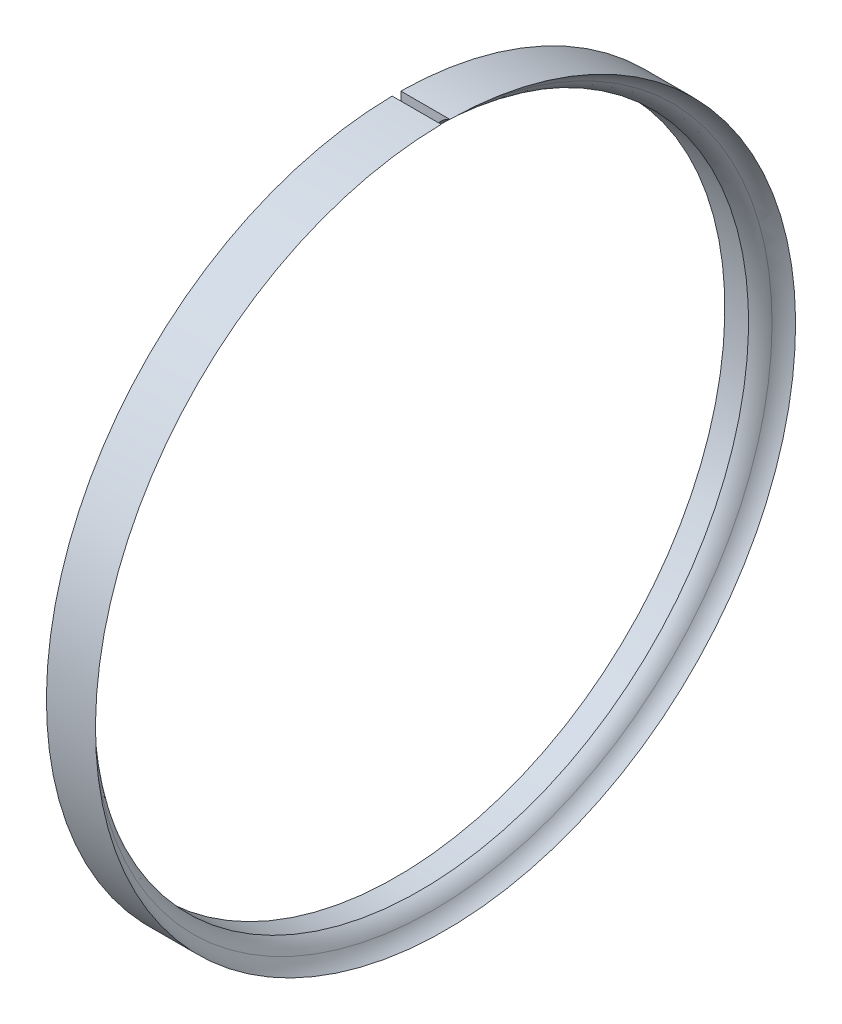
ISO-10303-21;
HEADER;
FILE_DESCRIPTION(('STEP AP214'),'2;1');
FILE_NAME('part.step','',(''),(''),'','','');
FILE_SCHEMA(('AUTOMOTIVE_DESIGN { 1 0 10303 214 1 1 1 1 }'));
ENDSEC;
DATA;
#1=APPLICATION_CONTEXT('core data for automotive mechanical design processes');
#2=APPLICATION_PROTOCOL_DEFINITION('international standard','automotive_design',2000,#1);
#3=PRODUCT_CONTEXT('',#1,'mechanical');
#4=PRODUCT('Part','Part','',(#3));
#5=PRODUCT_RELATED_PRODUCT_CATEGORY('part','',(#4));
#6=PRODUCT_DEFINITION_FORMATION('','',#4);
#7=PRODUCT_DEFINITION_CONTEXT('part definition',#1,'design');
#8=PRODUCT_DEFINITION('design','',#6,#7);
#9=PRODUCT_DEFINITION_SHAPE('','',#8);
#10=(LENGTH_UNIT() NAMED_UNIT(*) SI_UNIT(.MILLI.,.METRE.));
#11=(NAMED_UNIT(*) PLANE_ANGLE_UNIT() SI_UNIT($,.RADIAN.));
#12=(NAMED_UNIT(*) SI_UNIT($,.STERADIAN.) SOLID_ANGLE_UNIT());
#13=UNCERTAINTY_MEASURE_WITH_UNIT(LENGTH_MEASURE(1.E-05),#10,'distance_accuracy_value','');
#14=(GEOMETRIC_REPRESENTATION_CONTEXT(3) GLOBAL_UNCERTAINTY_ASSIGNED_CONTEXT((#13)) GLOBAL_UNIT_ASSIGNED_CONTEXT((#10,
#11,#12)) REPRESENTATION_CONTEXT('',''));
#15=CARTESIAN_POINT('',(0.,0.,0.));
#16=DIRECTION('',(0.,0.,1.));
#17=DIRECTION('',(1.,0.,0.));
#18=AXIS2_PLACEMENT_3D('',#15,#16,#17);
#19=CARTESIAN_POINT('',(245.605182082093,0.,0.));
#20=DIRECTION('',(1.,0.,0.));
#21=DIRECTION('',(0.,0.,-1.));
#22=AXIS2_PLACEMENT_3D('',#19,#20,#21);
#23=CYLINDRICAL_SURFACE('',#22,80.8173396422522);
#24=DIRECTION('',(1.,0.,0.));
#25=VECTOR('',#24,1.);
#26=CARTESIAN_POINT('',(245.605182082093,80.8111526142967,-1.));
#27=LINE('',#26,#25);
#28=CARTESIAN_POINT('',(256.928062642233,80.8111526142967,-1.));
#29=VERTEX_POINT('',#28);
#30=CARTESIAN_POINT('',(245.605182082093,80.8111526142967,-1.));
#31=VERTEX_POINT('',#30);
#32=EDGE_CURVE('E180',#29,#31,#27,.F.);
#33=ORIENTED_EDGE('',*,*,#32,.F.);
#34=CARTESIAN_POINT('',(256.928062642233,0.,0.));
#35=DIRECTION('',(1.,0.,0.));
#36=DIRECTION('',(0.,0.,-1.));
#37=AXIS2_PLACEMENT_3D('',#34,#35,#36);
#38=CIRCLE('',#37,80.8173396422522);
#39=CARTESIAN_POINT('',(256.928062642233,80.8111526142967,1.00000000000005));
#40=VERTEX_POINT('',#39);
#41=EDGE_CURVE('E125',#29,#40,#38,.F.);
#42=ORIENTED_EDGE('',*,*,#41,.T.);
#43=DIRECTION('',(1.,0.,0.));
#44=VECTOR('',#43,1.);
#45=CARTESIAN_POINT('',(245.605182082093,80.8111526142967,1.00000000000005));
#46=LINE('',#45,#44);
#47=CARTESIAN_POINT('',(245.605182082093,80.8111526142967,1.00000000000005));
#48=VERTEX_POINT('',#47);
#49=EDGE_CURVE('E79',#48,#40,#46,.T.);
#50=ORIENTED_EDGE('',*,*,#49,.F.);
#51=CARTESIAN_POINT('',(245.605182082093,0.,0.));
#52=DIRECTION('',(1.,0.,0.));
#53=DIRECTION('',(0.,0.,-1.));
#54=AXIS2_PLACEMENT_3D('',#51,#52,#53);
#55=CIRCLE('',#54,80.8173396422522);
#56=EDGE_CURVE('E123',#48,#31,#55,.T.);
#57=ORIENTED_EDGE('',*,*,#56,.T.);
#58=EDGE_LOOP('',(#33,#42,#50,#57));
#59=FACE_BOUND('',#58,.T.);
#60=ADVANCED_FACE('F48',(#59),#23,.T.);
#61=CARTESIAN_POINT('',(245.605182082093,0.,0.));
#62=DIRECTION('',(1.,0.,0.));
#63=DIRECTION('',(0.,0.,-1.));
#64=AXIS2_PLACEMENT_3D('',#61,#62,#63);
#65=CYLINDRICAL_SURFACE('',#64,75.8090467793956);
#66=CARTESIAN_POINT('',(251.078546972724,0.,0.));
#67=DIRECTION('',(-1.,0.,0.));
#68=DIRECTION('',(0.,0.,1.));
#69=AXIS2_PLACEMENT_3D('',#66,#67,#68);
#70=CIRCLE('',#69,75.8090467793956);
#71=CARTESIAN_POINT('',(251.078546972724,75.8024509735707,-1.));
#72=VERTEX_POINT('',#71);
#73=CARTESIAN_POINT('',(251.078546972724,75.8024509735707,1.00000000000005));
#74=VERTEX_POINT('',#73);
#75=EDGE_CURVE('E138',#72,#74,#70,.T.);
#76=ORIENTED_EDGE('',*,*,#75,.F.);
#77=DIRECTION('',(1.,0.,0.));
#78=VECTOR('',#77,1.);
#79=CARTESIAN_POINT('',(245.605182082093,75.8024509735707,-1.));
#80=LINE('',#79,#78);
#81=CARTESIAN_POINT('',(245.605182082093,75.8024509735708,-1.));
#82=VERTEX_POINT('',#81);
#83=EDGE_CURVE('E176',#72,#82,#80,.F.);
#84=ORIENTED_EDGE('',*,*,#83,.T.);
#85=CARTESIAN_POINT('',(245.605182082093,0.,0.));
#86=DIRECTION('',(1.,0.,0.));
#87=DIRECTION('',(0.,0.,-1.));
#88=AXIS2_PLACEMENT_3D('',#85,#86,#87);
#89=CIRCLE('',#88,75.8090467793956);
#90=CARTESIAN_POINT('',(245.605182082093,75.8024509735708,1.00000000000005));
#91=VERTEX_POINT('',#90);
#92=EDGE_CURVE('E131',#91,#82,#89,.T.);
#93=ORIENTED_EDGE('',*,*,#92,.F.);
#94=DIRECTION('',(1.,0.,0.));
#95=VECTOR('',#94,1.);
#96=CARTESIAN_POINT('',(245.605182082093,75.8024509735707,1.00000000000005));
#97=LINE('',#96,#95);
#98=EDGE_CURVE('E110',#91,#74,#97,.T.);
#99=ORIENTED_EDGE('',*,*,#98,.T.);
#100=EDGE_LOOP('',(#76,#84,#93,#99));
#101=FACE_BOUND('',#100,.T.);
#102=ADVANCED_FACE('F168',(#101),#65,.F.);
#103=CARTESIAN_POINT('',(245.605182082093,0.,0.));
#104=DIRECTION('',(1.,0.,0.));
#105=DIRECTION('',(0.,0.,-1.));
#106=AXIS2_PLACEMENT_3D('',#103,#104,#105);
#107=PLANE('',#106);
#108=ORIENTED_EDGE('',*,*,#92,.T.);
#109=DIRECTION('',(0.,1.,0.));
#110=VECTOR('',#109,1.);
#111=CARTESIAN_POINT('',(245.605182082093,0.,-1.));
#112=LINE('',#111,#110);
#113=EDGE_CURVE('E117',#82,#31,#112,.T.);
#114=ORIENTED_EDGE('',*,*,#113,.T.);
#115=ORIENTED_EDGE('',*,*,#56,.F.);
#116=DIRECTION('',(0.,-1.,0.));
#117=VECTOR('',#116,1.);
#118=CARTESIAN_POINT('',(245.605182082093,0.,1.));
#119=LINE('',#118,#117);
#120=EDGE_CURVE('E107',#48,#91,#119,.T.);
#121=ORIENTED_EDGE('',*,*,#120,.T.);
#122=EDGE_LOOP('',(#108,#114,#115,#121));
#123=FACE_BOUND('',#122,.T.);
#124=ADVANCED_FACE('F129',(#123),#107,.F.);
#125=CARTESIAN_POINT('',(248.602119550721,0.,0.));
#126=DIRECTION('',(-1.,0.,0.));
#127=DIRECTION('',(0.,0.,1.));
#128=AXIS2_PLACEMENT_3D('',#125,#126,#127);
#129=TOROIDAL_SURFACE('',#128,81.6562518573413,6.35000000000001);
#130=CARTESIAN_POINT('',(252.174779981374,76.4000793266461,-1.));
#131=CARTESIAN_POINT('',(252.322275944406,76.50046548346,-1.));
#132=CARTESIAN_POINT('',(252.465520499502,76.6070607885492,-1.));
#133=CARTESIAN_POINT('',(252.74257354886,76.8319675161556,-1.));
#134=CARTESIAN_POINT('',(252.876379548463,76.9502820163995,-1.));
#135=CARTESIAN_POINT('',(253.133666018792,77.1978668051728,-1.));
#136=CARTESIAN_POINT('',(253.257137166223,77.3271467786958,-1.));
#137=CARTESIAN_POINT('',(253.492788583646,77.5957022481378,-1.));
#138=CARTESIAN_POINT('',(253.604964707096,77.73498138296,-1.));
#139=CARTESIAN_POINT('',(253.81708510896,78.022378734622,-1.));
#140=CARTESIAN_POINT('',(253.917039685121,78.1704893513869,-1.));
#141=CARTESIAN_POINT('',(254.104152277925,78.4746599731871,-1.));
#142=CARTESIAN_POINT('',(254.191305563121,78.630722888887,-1.));
#143=CARTESIAN_POINT('',(254.35210201808,78.9495388677056,-1.));
#144=CARTESIAN_POINT('',(254.425753499102,79.1122877391263,-1.));
#145=CARTESIAN_POINT('',(254.559114347754,79.4434708359367,-1.));
#146=CARTESIAN_POINT('',(254.618818559615,79.6119071374999,-1.));
#147=CARTESIAN_POINT('',(254.72381448585,79.9531744514665,-1.));
#148=CARTESIAN_POINT('',(254.769109238213,80.1260045292077,-1.));
#149=CARTESIAN_POINT('',(254.844995702298,80.4749299442823,-1.));
#150=CARTESIAN_POINT('',(254.87558197861,80.6510264637771,-1.));
#151=CARTESIAN_POINT('',(254.921801460338,81.0051119590754,-1.));
#152=CARTESIAN_POINT('',(254.937439589765,81.183100292156,-1.));
#153=CARTESIAN_POINT('',(254.953672304582,81.5398273886752,-1.));
#154=CARTESIAN_POINT('',(254.954261333405,81.7185664049261,-1.));
#155=CARTESIAN_POINT('',(254.940379295279,82.0753963036045,-1.));
#156=CARTESIAN_POINT('',(254.925913534502,82.2534873922053,-1.));
#157=CARTESIAN_POINT('',(254.882027128322,82.6078808668688,-1.));
#158=CARTESIAN_POINT('',(254.85260096339,82.784182568247,-1.));
#159=CARTESIAN_POINT('',(254.779004523593,83.1336257739766,-1.));
#160=CARTESIAN_POINT('',(254.734839723647,83.3067684266598,-1.));
#161=CARTESIAN_POINT('',(254.632092083256,83.6487402258131,-1.));
#162=CARTESIAN_POINT('',(254.573503925779,83.8175677561635,-1.));
#163=CARTESIAN_POINT('',(254.376701507396,84.3156161248855,-1.));
#164=CARTESIAN_POINT('',(254.217367998853,84.6367870470122,-1.));
#165=CARTESIAN_POINT('',(253.847118419063,85.2476384828499,-1.));
#166=CARTESIAN_POINT('',(253.636202453391,85.5373190610106,-1.));
#167=CARTESIAN_POINT('',(253.168718496844,86.077188945176,-1.));
#168=CARTESIAN_POINT('',(252.912152910862,86.3273803302235,-1.));
#169=CARTESIAN_POINT('',(252.360662660482,86.7811221958516,-1.));
#170=CARTESIAN_POINT('',(252.065737969135,86.9846726436633,-1.));
#171=CARTESIAN_POINT('',(251.445918105323,87.3393568431541,-1.));
#172=CARTESIAN_POINT('',(251.121024942565,87.4904941064672,-1.));
#173=CARTESIAN_POINT('',(250.450475828821,87.7360741847269,-1.));
#174=CARTESIAN_POINT('',(250.104819893004,87.8305170410966,-1.));
#175=CARTESIAN_POINT('',(249.402576980599,87.9600239539149,-1.));
#176=CARTESIAN_POINT('',(249.045990595704,87.9950912187592,-1.));
#177=CARTESIAN_POINT('',(248.331991873511,88.0048607126399,-1.));
#178=CARTESIAN_POINT('',(247.974579536254,87.9795629447596,-1.));
#179=CARTESIAN_POINT('',(247.26908325338,87.8693221377576,-1.));
#180=CARTESIAN_POINT('',(246.920999097328,87.7843804453165,-1.));
#181=CARTESIAN_POINT('',(246.244031492747,87.5572652731054,-1.));
#182=CARTESIAN_POINT('',(245.915148043804,87.4150917945712,-1.));
#183=CARTESIAN_POINT('',(245.285911581679,87.0775471719247,-1.));
#184=CARTESIAN_POINT('',(244.985559043213,86.8821751428696,-1.));
#185=CARTESIAN_POINT('',(244.421915076656,86.4437815654728,-1.));
#186=CARTESIAN_POINT('',(244.158623658555,86.2007600042873,-1.));
#187=CARTESIAN_POINT('',(243.676561488449,85.673953299449,-1.));
#188=CARTESIAN_POINT('',(243.457792977233,85.390166105333,-1.));
#189=CARTESIAN_POINT('',(243.071001208735,84.7898935605252,-1.));
#190=CARTESIAN_POINT('',(242.902977962747,84.4734082025563,-1.));
#191=CARTESIAN_POINT('',(242.622434380994,83.8167012013952,-1.));
#192=CARTESIAN_POINT('',(242.509917722353,83.4764779873543,-1.));
#193=CARTESIAN_POINT('',(242.343597010505,82.781970256834,-1.));
#194=CARTESIAN_POINT('',(242.289793001801,82.4276857296969,-1.));
#195=CARTESIAN_POINT('',(242.242419421931,81.7150945341144,-1.));
#196=CARTESIAN_POINT('',(242.24885330093,81.3567876364592,-1.));
#197=CARTESIAN_POINT('',(242.3217923838,80.6463293262513,-1.));
#198=CARTESIAN_POINT('',(242.388297536236,80.2941779084286,-1.));
#199=CARTESIAN_POINT('',(242.579450780757,79.6060694940481,-1.));
#200=CARTESIAN_POINT('',(242.70410012288,79.2701128458325,-1.));
#201=CARTESIAN_POINT('',(243.008165967969,78.6237505074772,-1.));
#202=CARTESIAN_POINT('',(243.187582565835,78.3133448616135,-1.));
#203=CARTESIAN_POINT('',(243.493620371621,77.8738848578564,-1.));
#204=CARTESIAN_POINT('',(243.601851241601,77.7316889152222,-1.));
#205=CARTESIAN_POINT('',(243.829890744217,77.4569290757317,-1.));
#206=CARTESIAN_POINT('',(243.94969508804,77.3243616424743,-1.));
#207=CARTESIAN_POINT('',(244.200084888325,77.0697538982917,-1.));
#208=CARTESIAN_POINT('',(244.330674328671,76.9477175117514,-1.));
#209=CARTESIAN_POINT('',(244.601623792199,76.7151228437037,-1.));
#210=CARTESIAN_POINT('',(244.741980190422,76.6045603412756,-1.));
#211=CARTESIAN_POINT('',(245.031553216152,76.3956190263019,-1.));
#212=CARTESIAN_POINT('',(245.180772646337,76.297244098399,-1.));
#213=CARTESIAN_POINT('',(245.486913859173,76.1134518638342,-1.));
#214=CARTESIAN_POINT('',(245.643832777658,76.0280297864357,-1.));
#215=CARTESIAN_POINT('',(245.964361375039,75.870681490594,-1.));
#216=CARTESIAN_POINT('',(246.127973242162,75.7987597296648,-1.));
#217=CARTESIAN_POINT('',(246.460614037752,75.6689827011062,-1.));
#218=CARTESIAN_POINT('',(246.629640943773,75.6111222495118,-1.));
#219=CARTESIAN_POINT('',(246.971999292511,75.5098356848101,-1.));
#220=CARTESIAN_POINT('',(247.145331517013,75.4664122141549,-1.));
#221=CARTESIAN_POINT('',(247.494973528199,75.3943364356466,-1.));
#222=CARTESIAN_POINT('',(247.671282192467,75.3656786827035,-1.));
#223=CARTESIAN_POINT('',(248.025796341238,75.3233007884721,-1.));
#224=CARTESIAN_POINT('',(248.204002930196,75.3095898856174,-1.));
#225=CARTESIAN_POINT('',(248.560871657343,75.2972371255232,-1.));
#226=CARTESIAN_POINT('',(248.739533603409,75.2985897158164,-1.));
#227=CARTESIAN_POINT('',(249.096250484204,75.3163481270347,-1.));
#228=CARTESIAN_POINT('',(249.27430482387,75.3327659071575,-1.));
#229=CARTESIAN_POINT('',(249.628329897594,75.3805453798512,-1.));
#230=CARTESIAN_POINT('',(249.804301369679,75.4119016062713,-1.));
#231=CARTESIAN_POINT('',(250.152822812044,75.4892997935234,-1.));
#232=CARTESIAN_POINT('',(250.325375691931,75.5353286409155,-1.));
#233=CARTESIAN_POINT('',(250.665938314824,75.6417324870781,-1.));
#234=CARTESIAN_POINT('',(250.83394924112,75.7021037084,-1.));
#235=CARTESIAN_POINT('',(251.205396520673,75.8535376334756,-1.));
#236=CARTESIAN_POINT('',(251.407256067107,75.9484991822483,-1.));
#237=CARTESIAN_POINT('',(251.79987909531,76.1591078180682,-1.));
#238=CARTESIAN_POINT('',(251.990642577339,76.2747549046296,-1.));
#239=CARTESIAN_POINT('',(252.174779981374,76.4000793266461,-1.));
#240=B_SPLINE_CURVE_WITH_KNOTS('',3,(#130,#131,#132,#133,#134,#135,#136,#137,#138,#139,#140,
#141,#142,#143,#144,#145,#146,#147,#148,#149,#150,#151,#152,#153,#154,#155,#156,#157,#158,#159,
#160,#161,#162,#163,#164,#165,#166,#167,#168,#169,#170,#171,#172,#173,#174,#175,#176,#177,#178,
#179,#180,#181,#182,#183,#184,#185,#186,#187,#188,#189,#190,#191,#192,#193,#194,#195,#196,#197,
#198,#199,#200,#201,#202,#203,#204,#205,#206,#207,#208,#209,#210,#211,#212,#213,#214,#215,#216,
#217,#218,#219,#220,#221,#222,#223,#224,#225,#226,#227,#228,#229,#230,#231,#232,#233,#234,#235,
#236,#237,#238,#239),.UNSPECIFIED.,.T.,.F.,(4,2,2,2,2,2,2,2,2,2,2,2,2,2,2,2,2,2,2,2,2,2,2,2,2,2,
2,2,2,2,2,2,2,2,2,2,2,2,2,2,2,2,2,2,2,2,2,2,2,2,2,2,2,2,4),(0.,0.535054846147242,
1.07025058429552,1.60592404424842,2.14179344489367,2.6772081698247,3.21282029255699,
3.74810159510271,4.28358045858398,4.8189463505157,5.35450993124974,5.88989703320143,
6.42548181281414,6.96087788549499,7.49647163201294,8.03186664404654,8.56745932059827,
9.63748109329929,10.7075006759935,11.7774639050603,12.8474278858596,13.9173201662273,
14.9872116648903,16.0570453494785,17.1268789794207,18.1966884547169,19.2664979069147,
20.33632515618,21.4061526938177,22.4760340613776,23.5459156670509,24.6158681392387,
25.6858214224109,26.7558359882301,27.8258496378912,28.8958862928042,29.9659248018882,
30.5015032019427,31.0368838871183,31.5724632275389,32.1078448396401,32.643396661536,
33.1787507497078,33.7142812905413,34.2496140974718,34.7850448344018,35.3202779812802,
35.8558417608444,36.3912081358716,36.9269998687258,37.4625956995688,37.9977141852809,
38.5326918891455,39.2006668674055,39.8686418299773),.UNSPECIFIED.);
#241=CARTESIAN_POINT('',(254.,78.3054107553104,-1.));
#242=VERTEX_POINT('',#241);
#243=EDGE_CURVE('E70',#72,#242,#240,.T.);
#244=ORIENTED_EDGE('',*,*,#243,.F.);
#245=ORIENTED_EDGE('',*,*,#75,.T.);
#246=CARTESIAN_POINT('',(252.174779981374,76.4000793266461,1.00000000000005));
#247=CARTESIAN_POINT('',(252.027302327781,76.2997025333629,1.00000000000005));
#248=CARTESIAN_POINT('',(251.875608967584,76.2055571111748,1.00000000000005));
#249=CARTESIAN_POINT('',(251.564785695719,76.030339873841,1.00000000000005));
#250=CARTESIAN_POINT('',(251.405653839408,75.9492715023577,1.00000000000005));
#251=CARTESIAN_POINT('',(251.080986902498,75.8007574386769,1.00000000000005));
#252=CARTESIAN_POINT('',(250.915446242847,75.7333239488944,1.00000000000005));
#253=CARTESIAN_POINT('',(250.579208508611,75.6126257359875,1.00000000000005));
#254=CARTESIAN_POINT('',(250.40850957045,75.5593662034385,1.00000000000005));
#255=CARTESIAN_POINT('',(250.063374975924,75.4674672386836,1.00000000000005));
#256=CARTESIAN_POINT('',(249.888942589241,75.4288155256415,1.00000000000005));
#257=CARTESIAN_POINT('',(249.537376829307,75.366332053604,1.00000000000005));
#258=CARTESIAN_POINT('',(249.360242483938,75.3425057638476,1.00000000000005));
#259=CARTESIAN_POINT('',(249.004705992673,75.3098753588499,1.00000000000005));
#260=CARTESIAN_POINT('',(248.826304697144,75.3010619769172,1.00000000000005));
#261=CARTESIAN_POINT('',(248.469327677826,75.2984909230916,1.00000000000005));
#262=CARTESIAN_POINT('',(248.290751913961,75.3047388088242,1.00000000000005));
#263=CARTESIAN_POINT('',(247.934814648648,75.332253347396,1.00000000000005));
#264=CARTESIAN_POINT('',(247.757452802311,75.3535155390468,1.00000000000005));
#265=CARTESIAN_POINT('',(247.405084987076,75.4109132690884,1.00000000000005));
#266=CARTESIAN_POINT('',(247.230079912243,75.4470542964086,1.00000000000005));
#267=CARTESIAN_POINT('',(246.883794305314,75.5339386122482,1.00000000000005));
#268=CARTESIAN_POINT('',(246.712512563634,75.5846770799368,1.00000000000005));
#269=CARTESIAN_POINT('',(246.374768926827,75.7004213563779,1.00000000000005));
#270=CARTESIAN_POINT('',(246.208308834682,75.7654324261429,1.00000000000005));
#271=CARTESIAN_POINT('',(245.881519113436,75.9092223689079,1.00000000000005));
#272=CARTESIAN_POINT('',(245.721187203973,75.9879960586862,1.00000000000005));
#273=CARTESIAN_POINT('',(245.407671693895,76.1587958131048,1.00000000000005));
#274=CARTESIAN_POINT('',(245.254490754164,76.2508267595542,1.00000000000005));
#275=CARTESIAN_POINT('',(244.956475067217,76.4474416992488,1.00000000000005));
#276=CARTESIAN_POINT('',(244.811637245902,76.552021024568,1.00000000000005));
#277=CARTESIAN_POINT('',(244.531260404329,76.7730062125956,1.00000000000005));
#278=CARTESIAN_POINT('',(244.395724837149,76.8894164276797,1.00000000000005));
#279=CARTESIAN_POINT('',(244.004655441021,77.2551376276184,1.00000000000005));
#280=CARTESIAN_POINT('',(243.76435518458,77.5211399476401,1.00000000000005));
#281=CARTESIAN_POINT('',(243.331957577043,78.0895699702113,1.00000000000005));
#282=CARTESIAN_POINT('',(243.139860160954,78.3919976236467,1.00000000000005));
#283=CARTESIAN_POINT('',(242.809107629267,79.0248712884257,1.00000000000005));
#284=CARTESIAN_POINT('',(242.670456927411,79.3553196110267,1.00000000000005));
#285=CARTESIAN_POINT('',(242.450607015858,80.0347930244583,1.00000000000005));
#286=CARTESIAN_POINT('',(242.369407888164,80.3838181418032,1.00000000000005));
#287=CARTESIAN_POINT('',(242.266748249481,81.0905700234507,1.00000000000005));
#288=CARTESIAN_POINT('',(242.245291271606,81.4482973011316,1.00000000000005));
#289=CARTESIAN_POINT('',(242.262739023466,82.1622760423287,1.00000000000005));
#290=CARTESIAN_POINT('',(242.301643737017,82.5185275062405,1.00000000000005));
#291=CARTESIAN_POINT('',(242.4387111337,83.2194470752379,1.00000000000005));
#292=CARTESIAN_POINT('',(242.536874554874,83.5641150359994,1.00000000000005));
#293=CARTESIAN_POINT('',(242.78967497267,84.2320777799297,1.00000000000005));
#294=CARTESIAN_POINT('',(242.944311969431,84.555372563046,1.00000000000005));
#295=CARTESIAN_POINT('',(243.305664686466,85.1713991352006,1.00000000000005));
#296=CARTESIAN_POINT('',(243.512378594995,85.4641319869816,1.00000000000005));
#297=CARTESIAN_POINT('',(243.972020920625,86.0107356704939,1.00000000000005));
#298=CARTESIAN_POINT('',(244.224949321282,86.2646065160529,1.00000000000005));
#299=CARTESIAN_POINT('',(244.769823873944,86.7262624694069,1.00000000000005));
#300=CARTESIAN_POINT('',(245.061767579459,86.9340504646971,1.00000000000005));
#301=CARTESIAN_POINT('',(245.67639772757,87.2976603528816,1.00000000000005));
#302=CARTESIAN_POINT('',(245.999084160551,87.453482262029,1.00000000000005));
#303=CARTESIAN_POINT('',(246.666017431334,87.7087264931436,1.00000000000005));
#304=CARTESIAN_POINT('',(247.010262890204,87.8081524181603,1.00000000000005));
#305=CARTESIAN_POINT('',(247.710560213555,87.9477964142573,1.00000000000005));
#306=CARTESIAN_POINT('',(248.06661207329,87.9880145091404,1.00000000000005));
#307=CARTESIAN_POINT('',(248.78039900645,88.0081006020917,1.00000000000005));
#308=CARTESIAN_POINT('',(249.138134009259,87.9879711099045,1.00000000000005));
#309=CARTESIAN_POINT('',(249.845147502183,87.8879379804684,1.00000000000005));
#310=CARTESIAN_POINT('',(250.194425989651,87.8080343245153,1.00000000000005));
#311=CARTESIAN_POINT('',(250.874607723746,87.5907265571652,1.00000000000005));
#312=CARTESIAN_POINT('',(251.20551105221,87.4533227018858,1.00000000000005));
#313=CARTESIAN_POINT('',(251.839559751945,87.1249006068954,1.00000000000005));
#314=CARTESIAN_POINT('',(252.142705149181,86.9338824173375,1.00000000000005));
#315=CARTESIAN_POINT('',(252.712612991604,86.5037064316604,1.00000000000005));
#316=CARTESIAN_POINT('',(252.979374232018,86.2645470421121,1.00000000000005));
#317=CARTESIAN_POINT('',(253.469048255317,85.7446633489267,1.00000000000005));
#318=CARTESIAN_POINT('',(253.691960946202,85.4639389580835,1.00000000000005));
#319=CARTESIAN_POINT('',(253.988485437334,85.0180993318747,1.00000000000005));
#320=CARTESIAN_POINT('',(254.081061140613,84.8652671667981,1.00000000000005));
#321=CARTESIAN_POINT('',(254.253007657501,84.5523665812577,1.00000000000005));
#322=CARTESIAN_POINT('',(254.332383330548,84.3923008514687,1.00000000000005));
#323=CARTESIAN_POINT('',(254.477390002009,84.0660024002269,1.00000000000005));
#324=CARTESIAN_POINT('',(254.543015884253,83.8997674102366,1.00000000000005));
#325=CARTESIAN_POINT('',(254.66000959132,83.5624190859435,1.00000000000005));
#326=CARTESIAN_POINT('',(254.711382667961,83.3913075742195,1.00000000000005));
#327=CARTESIAN_POINT('',(254.799554859507,83.0452880613516,1.00000000000005));
#328=CARTESIAN_POINT('',(254.836347356667,82.8703783742169,1.00000000000005));
#329=CARTESIAN_POINT('',(254.895053624573,82.5181458873518,1.00000000000005));
#330=CARTESIAN_POINT('',(254.91697288052,82.340824001869,1.00000000000005));
#331=CARTESIAN_POINT('',(254.945803369891,81.9849053587452,1.00000000000005));
#332=CARTESIAN_POINT('',(254.952709646527,81.8063081995716,1.00000000000005));
#333=CARTESIAN_POINT('',(254.951450746875,81.4492330249414,1.00000000000005));
#334=CARTESIAN_POINT('',(254.943291132176,81.2707549898398,1.00000000000005));
#335=CARTESIAN_POINT('',(254.9119644874,80.9150653537947,1.00000000000005));
#336=CARTESIAN_POINT('',(254.888792834597,80.7378541599559,1.00000000000005));
#337=CARTESIAN_POINT('',(254.827613747898,80.3860789313362,1.00000000000005));
#338=CARTESIAN_POINT('',(254.789611790123,80.2115139441264,1.00000000000005));
#339=CARTESIAN_POINT('',(254.699013605192,79.8660976165097,1.00000000000005));
#340=CARTESIAN_POINT('',(254.646408372509,79.6952486380184,1.00000000000005));
#341=CARTESIAN_POINT('',(254.527009869642,79.35865358222,1.00000000000005));
#342=CARTESIAN_POINT('',(254.460221836171,79.1929056472467,1.00000000000005));
#343=CARTESIAN_POINT('',(254.312858182657,78.8674872096222,1.00000000000005));
#344=CARTESIAN_POINT('',(254.232270949996,78.7078219653037,1.00000000000005));
#345=CARTESIAN_POINT('',(254.057954372785,78.395911998697,1.00000000000005));
#346=CARTESIAN_POINT('',(253.964229844532,78.2436645843815,1.00000000000005));
#347=CARTESIAN_POINT('',(253.764369369271,77.9477408064477,1.00000000000005));
#348=CARTESIAN_POINT('',(253.658244556224,77.804056926242,1.00000000000005));
#349=CARTESIAN_POINT('',(253.434310693394,77.5261798487336,1.00000000000005));
#350=CARTESIAN_POINT('',(253.316504724516,77.3919841648305,1.00000000000005));
#351=CARTESIAN_POINT('',(253.03928412179,77.1018319479563,1.00000000000005));
#352=CARTESIAN_POINT('',(252.876813601073,76.9487787697798,1.00000000000005));
#353=CARTESIAN_POINT('',(252.536681860508,76.6606017431509,1.00000000000005));
#354=CARTESIAN_POINT('',(252.359020640692,76.5254778946607,1.00000000000005));
#355=CARTESIAN_POINT('',(252.174779981374,76.4000793266461,1.00000000000005));
#356=B_SPLINE_CURVE_WITH_KNOTS('',3,(#246,#247,#248,#249,#250,#251,#252,#253,#254,#255,#256,
#257,#258,#259,#260,#261,#262,#263,#264,#265,#266,#267,#268,#269,#270,#271,#272,#273,#274,#275,
#276,#277,#278,#279,#280,#281,#282,#283,#284,#285,#286,#287,#288,#289,#290,#291,#292,#293,#294,
#295,#296,#297,#298,#299,#300,#301,#302,#303,#304,#305,#306,#307,#308,#309,#310,#311,#312,#313,
#314,#315,#316,#317,#318,#319,#320,#321,#322,#323,#324,#325,#326,#327,#328,#329,#330,#331,#332,
#333,#334,#335,#336,#337,#338,#339,#340,#341,#342,#343,#344,#345,#346,#347,#348,#349,#350,#351,
#352,#353,#354,#355),.UNSPECIFIED.,.T.,.F.,(4,2,2,2,2,2,2,2,2,2,2,2,2,2,2,2,2,2,2,2,2,2,2,2,2,2,
2,2,2,2,2,2,2,2,2,2,2,2,2,2,2,2,2,2,2,2,2,2,2,2,2,2,2,2,4),(0.,0.534993574499048,
1.07012780305338,1.60573884588824,2.14154576315094,2.67690121862581,3.2124540548857,
3.74767620214039,4.28309587722414,4.8183565304031,5.3538148229974,5.88909648212259,
6.42457578327465,6.95985384742687,7.49532952690449,8.03060662643657,8.5660813627248,
9.63595231128576,10.7058218173006,11.7757796564503,12.8457390227747,13.9157616644767,
14.9857840193033,16.0558197010819,17.1258553854857,18.1958538486919,19.2658519311778,
20.3357829499335,21.4057136340526,22.4755759543042,23.5454378444493,24.6152552416347,
25.6850729735785,26.7548859403849,27.8246979064457,28.8945452881134,29.9643949144225,
30.4999258103279,31.0352591181543,31.5707912661199,32.106125820383,32.6417030715335,
33.1770826961208,33.7126390584812,34.247997759213,34.7835213938829,35.3188474721473,
35.8545044107164,36.3899639116002,36.9258762593438,37.4615926462964,37.9968316681471,
38.5319298943158,39.2002858567452,39.8686418177685),.UNSPECIFIED.);
#357=CARTESIAN_POINT('',(254.,78.3054107553105,1.00000000000005));
#358=VERTEX_POINT('',#357);
#359=EDGE_CURVE('E116',#358,#74,#356,.T.);
#360=ORIENTED_EDGE('',*,*,#359,.F.);
#361=CARTESIAN_POINT('',(254.,0.,0.));
#362=DIRECTION('',(-1.,0.,0.));
#363=DIRECTION('',(0.,0.,1.));
#364=AXIS2_PLACEMENT_3D('',#361,#362,#363);
#365=CIRCLE('',#364,78.3117957497967);
#366=EDGE_CURVE('E142',#242,#358,#365,.T.);
#367=ORIENTED_EDGE('',*,*,#366,.F.);
#368=EDGE_LOOP('',(#244,#245,#360,#367));
#369=FACE_BOUND('',#368,.T.);
#370=ADVANCED_FACE('F163',(#369),#129,.T.);
#371=CARTESIAN_POINT('',(259.397880449279,0.,0.));
#372=DIRECTION('',(-1.,0.,0.));
#373=DIRECTION('',(0.,0.,1.));
#374=AXIS2_PLACEMENT_3D('',#371,#372,#373);
#375=TOROIDAL_SURFACE('',#374,74.9673396422522,6.35000000000003);
#376=CARTESIAN_POINT('',(256.207821774076,69.4696029724985,-1.));
#377=CARTESIAN_POINT('',(256.053558119944,69.559239512163,-1.));
#378=CARTESIAN_POINT('',(255.903093328648,69.6553719993339,-1.));
#379=CARTESIAN_POINT('',(255.610742308071,69.8599948129584,-1.));
#380=CARTESIAN_POINT('',(255.468858348429,69.9684883872386,-1.));
#381=CARTESIAN_POINT('',(255.194610260562,70.197138212683,-1.));
#382=CARTESIAN_POINT('',(255.062254743977,70.3173047889124,-1.));
#383=CARTESIAN_POINT('',(254.808094735025,70.5684114080963,-1.));
#384=CARTESIAN_POINT('',(254.686294119861,70.699355375832,-1.));
#385=CARTESIAN_POINT('',(254.454264809413,70.9709300602266,-1.));
#386=CARTESIAN_POINT('',(254.344026373694,71.1115524552522,-1.));
#387=CARTESIAN_POINT('',(254.13574781079,71.4016368047705,-1.));
#388=CARTESIAN_POINT('',(254.037712195873,71.5511019991258,-1.));
#389=CARTESIAN_POINT('',(253.854640525843,71.8576666627897,-1.));
#390=CARTESIAN_POINT('',(253.769596479106,72.0147613598621,-1.));
#391=CARTESIAN_POINT('',(253.613010249543,72.3356135295427,-1.));
#392=CARTESIAN_POINT('',(253.541473061624,72.499373439875,-1.));
#393=CARTESIAN_POINT('',(253.4124605462,72.8323045838531,-1.));
#394=CARTESIAN_POINT('',(253.354982458612,73.0014747479715,-1.));
#395=CARTESIAN_POINT('',(253.254459591539,73.3441182288905,-1.));
#396=CARTESIAN_POINT('',(253.211420149521,73.5175931116019,-1.));
#397=CARTESIAN_POINT('',(253.140121587515,73.8674945331788,-1.));
#398=CARTESIAN_POINT('',(253.111857603061,74.0439200808423,-1.));
#399=CARTESIAN_POINT('',(253.070281417296,74.3985901602005,-1.));
#400=CARTESIAN_POINT('',(253.05697474045,74.5768353394623,-1.));
#401=CARTESIAN_POINT('',(253.045429059578,74.9337540708185,-1.));
#402=CARTESIAN_POINT('',(253.047185016548,75.1124274596652,-1.));
#403=CARTESIAN_POINT('',(253.065741438904,75.4690542696052,-1.));
#404=CARTESIAN_POINT('',(253.082547458693,75.6470074005198,-1.));
#405=CARTESIAN_POINT('',(253.131091351831,76.0008106773826,-1.));
#406=CARTESIAN_POINT('',(253.16282368318,76.1766615790405,-1.));
#407=CARTESIAN_POINT('',(253.240977026325,76.5250867909702,-1.));
#408=CARTESIAN_POINT('',(253.28740345678,76.6976598675724,-1.));
#409=CARTESIAN_POINT('',(253.448268802241,77.2084660943811,-1.));
#410=CARTESIAN_POINT('',(253.584347111951,77.5401724154828,-1.));
#411=CARTESIAN_POINT('',(253.910198413004,78.1758442992005,-1.));
#412=CARTESIAN_POINT('',(254.099971294347,78.479809918645,-1.));
#413=CARTESIAN_POINT('',(254.52786498948,79.0515963816866,-1.));
#414=CARTESIAN_POINT('',(254.765983110134,79.3194192372806,-1.));
#415=CARTESIAN_POINT('',(255.283801947617,79.811270138697,-1.));
#416=CARTESIAN_POINT('',(255.563502691569,80.0352981559517,-1.));
#417=CARTESIAN_POINT('',(256.156526874824,80.4331983098221,-1.));
#418=CARTESIAN_POINT('',(256.469847678062,80.6070743747897,-1.));
#419=CARTESIAN_POINT('',(257.121234471243,80.8997513074926,-1.));
#420=CARTESIAN_POINT('',(257.459300441235,81.0185522196338,-1.));
#421=CARTESIAN_POINT('',(258.150556287842,81.1976998341395,-1.));
#422=CARTESIAN_POINT('',(258.503745124795,81.2580505481108,-1.));
#423=CARTESIAN_POINT('',(259.215241817023,81.3185976523799,-1.));
#424=CARTESIAN_POINT('',(259.573549671657,81.3187940502035,-1.));
#425=CARTESIAN_POINT('',(260.285099672714,81.2590281087605,-1.));
#426=CARTESIAN_POINT('',(260.638341997676,81.1990678950826,-1.));
#427=CARTESIAN_POINT('',(261.329746538468,81.0206947193341,-1.));
#428=CARTESIAN_POINT('',(261.667908755371,80.9022817614216,-1.));
#429=CARTESIAN_POINT('',(262.319557671968,80.6103642286643,-1.));
#430=CARTESIAN_POINT('',(262.633044130568,80.4368591156269,-1.));
#431=CARTESIAN_POINT('',(263.226440527392,80.0396842144862,-1.));
#432=CARTESIAN_POINT('',(263.50635045686,79.8160144133001,-1.));
#433=CARTESIAN_POINT('',(264.024663929651,79.3248476103956,-1.));
#434=CARTESIAN_POINT('',(264.263065325384,79.0573483423934,-1.));
#435=CARTESIAN_POINT('',(264.691579076102,78.4861249805108,-1.));
#436=CARTESIAN_POINT('',(264.881691418461,78.1824008771588,-1.));
#437=CARTESIAN_POINT('',(265.208246059112,77.5473252396273,-1.));
#438=CARTESIAN_POINT('',(265.344684271763,77.2159716046304,-1.));
#439=CARTESIAN_POINT('',(265.559998623837,76.535061500953,-1.));
#440=CARTESIAN_POINT('',(265.638874715039,76.1855050170233,-1.));
#441=CARTESIAN_POINT('',(265.73683388592,75.4780887353223,-1.));
#442=CARTESIAN_POINT('',(265.755912601166,75.1202283333928,-1.));
#443=CARTESIAN_POINT('',(265.733713327144,74.406372814982,-1.));
#444=CARTESIAN_POINT('',(265.692435383807,74.0503776970817,-1.));
#445=CARTESIAN_POINT('',(265.550731083629,73.3503975524567,-1.));
#446=CARTESIAN_POINT('',(265.450302513922,73.0064129755647,-1.));
#447=CARTESIAN_POINT('',(265.192997779822,72.3400329631499,-1.));
#448=CARTESIAN_POINT('',(265.036121513734,72.017637566523,-1.));
#449=CARTESIAN_POINT('',(264.762125434298,71.5574988354133,-1.));
#450=CARTESIAN_POINT('',(264.664284797124,71.4079558349616,-1.));
#451=CARTESIAN_POINT('',(264.456369190647,71.1176538640861,-1.));
#452=CARTESIAN_POINT('',(264.34629875113,70.9768916713119,-1.));
#453=CARTESIAN_POINT('',(264.114654470007,70.7051008769987,-1.));
#454=CARTESIAN_POINT('',(263.99307637497,70.5740759067022,-1.));
#455=CARTESIAN_POINT('',(263.739357083404,70.3227801324806,-1.));
#456=CARTESIAN_POINT('',(263.607219803382,70.2025053759387,-1.));
#457=CARTESIAN_POINT('',(263.333240600238,69.9734792182035,-1.));
#458=CARTESIAN_POINT('',(263.19139564868,69.8647314402176,-1.));
#459=CARTESIAN_POINT('',(262.899100448684,69.6596130879617,-1.));
#460=CARTESIAN_POINT('',(262.748653396983,69.5632379583902,-1.));
#461=CARTESIAN_POINT('',(262.440124745006,69.3834738730371,-1.));
#462=CARTESIAN_POINT('',(262.282040645011,69.3000892074782,-1.));
#463=CARTESIAN_POINT('',(261.959467804731,69.146965995075,-1.));
#464=CARTESIAN_POINT('',(261.794981451002,69.0772224205877,-1.));
#465=CARTESIAN_POINT('',(261.460690626484,68.9518286872802,-1.));
#466=CARTESIAN_POINT('',(261.29088528064,68.8961808612555,-1.));
#467=CARTESIAN_POINT('',(260.947253399474,68.799407523429,-1.));
#468=CARTESIAN_POINT('',(260.773428371361,68.7582766595312,-1.));
#469=CARTESIAN_POINT('',(260.422823339446,68.6907802671527,-1.));
#470=CARTESIAN_POINT('',(260.246041576765,68.6644238744478,-1.));
#471=CARTESIAN_POINT('',(259.890951408132,68.6267101575177,-1.));
#472=CARTESIAN_POINT('',(259.712643588959,68.6153473078613,-1.));
#473=CARTESIAN_POINT('',(259.355566351881,68.6076806540846,-1.));
#474=CARTESIAN_POINT('',(259.176796683834,68.6113884869001,-1.));
#475=CARTESIAN_POINT('',(258.820272450273,68.6338585080687,-1.));
#476=CARTESIAN_POINT('',(258.642517537478,68.6526151911495,-1.));
#477=CARTESIAN_POINT('',(258.289375736074,68.7050206032298,-1.));
#478=CARTESIAN_POINT('',(258.113986877921,68.7386560430793,-1.));
#479=CARTESIAN_POINT('',(257.766720150367,68.8205600562677,-1.));
#480=CARTESIAN_POINT('',(257.594841369327,68.8688247771419,-1.));
#481=CARTESIAN_POINT('',(257.213575523892,68.99344418,-1.));
#482=CARTESIAN_POINT('',(257.005483545847,69.073798932763,-1.));
#483=CARTESIAN_POINT('',(256.598894919071,69.2559290171407,-1.));
#484=CARTESIAN_POINT('',(256.400398269983,69.3577043479589,-1.));
#485=CARTESIAN_POINT('',(256.207821774076,69.4696029724985,-1.));
#486=B_SPLINE_CURVE_WITH_KNOTS('',3,(#376,#377,#378,#379,#380,#381,#382,#383,#384,#385,#386,
#387,#388,#389,#390,#391,#392,#393,#394,#395,#396,#397,#398,#399,#400,#401,#402,#403,#404,#405,
#406,#407,#408,#409,#410,#411,#412,#413,#414,#415,#416,#417,#418,#419,#420,#421,#422,#423,#424,
#425,#426,#427,#428,#429,#430,#431,#432,#433,#434,#435,#436,#437,#438,#439,#440,#441,#442,#443,
#444,#445,#446,#447,#448,#449,#450,#451,#452,#453,#454,#455,#456,#457,#458,#459,#460,#461,#462,
#463,#464,#465,#466,#467,#468,#469,#470,#471,#472,#473,#474,#475,#476,#477,#478,#479,#480,#481,
#482,#483,#484,#485),.UNSPECIFIED.,.T.,.F.,(4,2,2,2,2,2,2,2,2,2,2,2,2,2,2,2,2,2,2,2,2,2,2,2,2,2,
2,2,2,2,2,2,2,2,2,2,2,2,2,2,2,2,2,2,2,2,2,2,2,2,2,2,2,2,4),(0.,0.535051023082929,
1.0702429543267,1.60591266324625,2.1417783164646,2.67718884675786,3.21279677268706,
3.74807388678083,4.28354856310646,4.81891803047709,5.35448518781008,5.88987591119415,
6.42546431559271,6.9608735529583,7.49648047090629,8.03188867980207,8.56749455858775,
9.63755153764909,10.7076063245915,11.7776015190858,12.8475974115452,13.9175094695325,
14.9874206648676,16.0572584238843,17.1270960490551,18.1968958736452,19.2666956221345,
20.336505821769,21.4063163004063,22.4761821130444,23.5460482054178,24.6159957195948,
25.6859441301143,26.755970631199,27.8259963180024,28.8960620377368,29.9661296852879,
30.5017273011917,31.0371271948018,31.5727257601694,32.1081265806173,32.6436951945,
33.1790660563676,33.7146133563704,34.2499628983307,34.7854009809103,35.3206414521116,
35.8562125245306,36.3915861727404,36.9273732920615,37.4629644954388,37.9980782916141,
38.5330512935437,39.2009873382855,39.8689233581891),.UNSPECIFIED.);
#487=EDGE_CURVE('E11',#242,#29,#486,.T.);
#488=ORIENTED_EDGE('',*,*,#487,.F.);
#489=ORIENTED_EDGE('',*,*,#366,.T.);
#490=CARTESIAN_POINT('',(256.207821774076,69.4696029724985,1.00000000000004));
#491=CARTESIAN_POINT('',(256.362063996351,69.3799759238385,1.00000000000004));
#492=CARTESIAN_POINT('',(256.52006776756,69.296864238222,1.00000000000004));
#493=CARTESIAN_POINT('',(256.842562654523,69.1442101386429,1.00000000000004));
#494=CARTESIAN_POINT('',(257.007055464756,69.0746712975292,1.00000000000004));
#495=CARTESIAN_POINT('',(257.341458668222,68.949637064179,1.00000000000004));
#496=CARTESIAN_POINT('',(257.511373757395,68.8941542383783,1.00000000000004));
#497=CARTESIAN_POINT('',(257.855339062804,68.7976880137476,1.00000000000004));
#498=CARTESIAN_POINT('',(258.029390768533,68.7567099247845,1.00000000000004));
#499=CARTESIAN_POINT('',(258.380181117643,68.6896023356888,1.00000000000004));
#500=CARTESIAN_POINT('',(258.556917373387,68.6634603529734,1.00000000000004));
#501=CARTESIAN_POINT('',(258.912029521622,68.6261505996856,1.00000000000004));
#502=CARTESIAN_POINT('',(259.090405994607,68.6149883535257,1.00000000000004));
#503=CARTESIAN_POINT('',(259.447354677991,68.6077377641282,1.00000000000004));
#504=CARTESIAN_POINT('',(259.625926699534,68.6116401180042,1.00000000000004));
#505=CARTESIAN_POINT('',(259.982173525636,68.6344743315897,1.00000000000004));
#506=CARTESIAN_POINT('',(260.159847974746,68.6534117375672,1.00000000000004));
#507=CARTESIAN_POINT('',(260.512917738988,68.7061804221999,1.00000000000004));
#508=CARTESIAN_POINT('',(260.688313708426,68.7400073231713,1.00000000000004));
#509=CARTESIAN_POINT('',(261.035697623521,68.8223286645182,1.00000000000004));
#510=CARTESIAN_POINT('',(261.2076842869,68.8708285160659,1.00000000000004));
#511=CARTESIAN_POINT('',(261.546903780559,68.9821279216803,1.00000000000004));
#512=CARTESIAN_POINT('',(261.714138160031,69.0449227541672,1.00000000000004));
#513=CARTESIAN_POINT('',(262.042784480591,69.1844000665071,1.00000000000004));
#514=CARTESIAN_POINT('',(262.204194249027,69.2610876656155,1.00000000000004));
#515=CARTESIAN_POINT('',(262.519922570084,69.4277604633497,1.00000000000004));
#516=CARTESIAN_POINT('',(262.674243639036,69.5177408947431,1.00000000000004));
#517=CARTESIAN_POINT('',(262.974812934604,69.710411744583,1.00000000000004));
#518=CARTESIAN_POINT('',(263.121058159834,69.8131068430736,1.00000000000004));
#519=CARTESIAN_POINT('',(263.404330778258,70.0304242298672,1.00000000000004));
#520=CARTESIAN_POINT('',(263.541361568786,70.1450420821496,1.00000000000004));
#521=CARTESIAN_POINT('',(263.805306887208,70.3854125228936,1.00000000000004));
#522=CARTESIAN_POINT('',(263.932217661205,70.5111692069941,1.00000000000004));
#523=CARTESIAN_POINT('',(264.296284889088,70.9037880246662,1.00000000000004));
#524=CARTESIAN_POINT('',(264.517058595529,71.1862159351126,1.00000000000004));
#525=CARTESIAN_POINT('',(264.907933899627,71.7839761529389,1.00000000000004));
#526=CARTESIAN_POINT('',(265.078035560975,72.0993084189605,1.00000000000004));
#527=CARTESIAN_POINT('',(265.362940812277,72.754123636871,1.00000000000004));
#528=CARTESIAN_POINT('',(265.477739053659,73.0936089210343,1.00000000000004));
#529=CARTESIAN_POINT('',(265.648706213626,73.787023111735,1.00000000000005));
#530=CARTESIAN_POINT('',(265.704875047441,74.1409520391552,1.00000000000005));
#531=CARTESIAN_POINT('',(265.757004130934,74.8532404751596,1.00000000000005));
#532=CARTESIAN_POINT('',(265.752960806621,75.2116002454823,1.00000000000005));
#533=CARTESIAN_POINT('',(265.684767531242,75.9225537526654,1.00000000000005));
#534=CARTESIAN_POINT('',(265.620617599297,76.2751474913599,1.00000000000005));
#535=CARTESIAN_POINT('',(265.434031754659,76.9645607434707,1.00000000000005));
#536=CARTESIAN_POINT('',(265.311595792895,77.3013802436065,1.00000000000005));
#537=CARTESIAN_POINT('',(265.011911593203,77.9496817915997,1.00000000000005));
#538=CARTESIAN_POINT('',(264.834663359845,78.2611638415687,1.00000000000005));
#539=CARTESIAN_POINT('',(264.430395376884,78.8499309003951,1.00000000000005));
#540=CARTESIAN_POINT('',(264.203378184729,79.1272176652803,1.00000000000005));
#541=CARTESIAN_POINT('',(263.706010239535,79.6397388836274,1.00000000000005));
#542=CARTESIAN_POINT('',(263.435659505514,79.8749733555445,1.00000000000005));
#543=CARTESIAN_POINT('',(262.859321226654,80.2966930619912,1.00000000000005));
#544=CARTESIAN_POINT('',(262.553336430224,80.4831820526033,1.00000000000005));
#545=CARTESIAN_POINT('',(261.914399282155,80.8021383655113,1.00000000000005));
#546=CARTESIAN_POINT('',(261.581446940355,80.9346057075173,1.00000000000005));
#547=CARTESIAN_POINT('',(260.898051823457,81.1417489665897,1.00000000000005));
#548=CARTESIAN_POINT('',(260.547610297881,81.2164290060195,1.00000000000005));
#549=CARTESIAN_POINT('',(259.839163475517,81.3058922832614,1.00000000000005));
#550=CARTESIAN_POINT('',(259.48115818183,81.3206755456273,1.00000000000005));
#551=CARTESIAN_POINT('',(258.767761983772,81.2899263978968,1.00000000000005));
#552=CARTESIAN_POINT('',(258.412370974455,81.2443964223972,1.00000000000005));
#553=CARTESIAN_POINT('',(257.714276515478,81.0943168841404,1.00000000000005));
#554=CARTESIAN_POINT('',(257.371573070245,80.9897673007973,1.00000000000005));
#555=CARTESIAN_POINT('',(256.708582082418,80.7246212302192,1.00000000000005));
#556=CARTESIAN_POINT('',(256.388294641298,80.5640244892885,1.00000000000005));
#557=CARTESIAN_POINT('',(255.779221060653,80.191328319426,1.00000000000005));
#558=CARTESIAN_POINT('',(255.490434893813,79.9792289351521,1.00000000000005));
#559=CARTESIAN_POINT('',(254.952573191457,79.5095988395369,1.00000000000005));
#560=CARTESIAN_POINT('',(254.703499519232,79.2520659976725,1.00000000000005));
#561=CARTESIAN_POINT('',(254.252046080988,78.6986602860327,1.00000000000005));
#562=CARTESIAN_POINT('',(254.049666416716,78.4027873327158,1.00000000000005));
#563=CARTESIAN_POINT('',(253.785604667896,77.9369777165176,1.00000000000005));
#564=CARTESIAN_POINT('',(253.704133395348,77.7779437685656,1.00000000000005));
#565=CARTESIAN_POINT('',(253.55487723057,77.4535971861807,1.00000000000005));
#566=CARTESIAN_POINT('',(253.487087299994,77.2882868898456,1.00000000000005));
#567=CARTESIAN_POINT('',(253.365656152286,76.9524925686656,1.00000000000005));
#568=CARTESIAN_POINT('',(253.312020200463,76.7820066447004,1.00000000000005));
#569=CARTESIAN_POINT('',(253.219317419001,76.4371829854656,1.00000000000005));
#570=CARTESIAN_POINT('',(253.180245221259,76.2628466945639,1.00000000000005));
#571=CARTESIAN_POINT('',(253.116907797565,75.9114222451976,1.00000000000005));
#572=CARTESIAN_POINT('',(253.092649430965,75.7343328508026,1.00000000000005));
#573=CARTESIAN_POINT('',(253.059145845295,75.3788053752347,1.00000000000005));
#574=CARTESIAN_POINT('',(253.049895089789,75.2003678158286,1.00000000000005));
#575=CARTESIAN_POINT('',(253.046454749621,74.8432885933366,1.00000000000005));
#576=CARTESIAN_POINT('',(253.052270138354,74.6646468823156,1.00000000000005));
#577=CARTESIAN_POINT('',(253.078926226813,74.3085544081087,1.00000000000005));
#578=CARTESIAN_POINT('',(253.099761380114,74.1311032296958,1.00000000000005));
#579=CARTESIAN_POINT('',(253.156311542118,73.7785317342724,1.00000000000005));
#580=CARTESIAN_POINT('',(253.192031129962,73.6034121516928,1.00000000000005));
#581=CARTESIAN_POINT('',(253.278080784883,73.2568689001295,1.00000000000005));
#582=CARTESIAN_POINT('',(253.328405457048,73.0854438914951,1.00000000000004));
#583=CARTESIAN_POINT('',(253.443348558517,72.7473364682591,1.00000000000004));
#584=CARTESIAN_POINT('',(253.507975802765,72.5806570502681,1.00000000000004));
#585=CARTESIAN_POINT('',(253.651020056144,72.253397749676,1.00000000000004));
#586=CARTESIAN_POINT('',(253.729431973378,72.0928156413415,1.00000000000004));
#587=CARTESIAN_POINT('',(253.899575860462,71.7786964538007,1.00000000000004));
#588=CARTESIAN_POINT('',(253.991318886821,71.6251653630208,1.00000000000004));
#589=CARTESIAN_POINT('',(254.187386320136,71.3264400979198,1.00000000000004));
#590=CARTESIAN_POINT('',(254.291706113984,71.1812428954326,1.00000000000004));
#591=CARTESIAN_POINT('',(254.512116408107,70.9002811540676,1.00000000000004));
#592=CARTESIAN_POINT('',(254.628196335872,70.7645083244268,1.00000000000004));
#593=CARTESIAN_POINT('',(254.871336145739,70.5032610001335,1.00000000000004));
#594=CARTESIAN_POINT('',(254.998393131307,70.3777838056908,1.00000000000004));
#595=CARTESIAN_POINT('',(255.295560010983,70.1080835268823,1.00000000000004));
#596=CARTESIAN_POINT('',(255.468511672926,69.9669740414478,1.00000000000004));
#597=CARTESIAN_POINT('',(255.828292424168,69.7037208844539,1.00000000000004));
#598=CARTESIAN_POINT('',(256.015121513328,69.5815772127045,1.00000000000004));
#599=CARTESIAN_POINT('',(256.207821774076,69.4696029724985,1.00000000000004));
#600=B_SPLINE_CURVE_WITH_KNOTS('',3,(#490,#491,#492,#493,#494,#495,#496,#497,#498,#499,#500,
#501,#502,#503,#504,#505,#506,#507,#508,#509,#510,#511,#512,#513,#514,#515,#516,#517,#518,#519,
#520,#521,#522,#523,#524,#525,#526,#527,#528,#529,#530,#531,#532,#533,#534,#535,#536,#537,#538,
#539,#540,#541,#542,#543,#544,#545,#546,#547,#548,#549,#550,#551,#552,#553,#554,#555,#556,#557,
#558,#559,#560,#561,#562,#563,#564,#565,#566,#567,#568,#569,#570,#571,#572,#573,#574,#575,#576,
#577,#578,#579,#580,#581,#582,#583,#584,#585,#586,#587,#588,#589,#590,#591,#592,#593,#594,#595,
#596,#597,#598,#599),.UNSPECIFIED.,.T.,.F.,(4,2,2,2,2,2,2,2,2,2,2,2,2,2,2,2,2,2,2,2,2,2,2,2,2,2,
2,2,2,2,2,2,2,2,2,2,2,2,2,2,2,2,2,2,2,2,2,2,2,2,2,2,2,2,4),(0.,0.534981060530342,
1.07010275747993,1.60570119185347,2.14149549480783,2.67683832822232,3.21237853777396,
3.74758808653385,4.28299516008742,4.81824492279807,5.35369231900296,5.88896311484326,
6.42443155182585,6.9597084168969,7.49518289695292,8.03045885434912,8.56593245101719,
9.63582478108134,10.7057157663894,11.7757102035775,12.8457061878381,13.9157656837123,
14.9858248391718,16.0558848955053,17.1259448626627,18.1959498562103,19.2659543801709,
20.335876430625,21.4057980907111,22.4756434189297,23.5454883085806,24.6152900143178,
25.6850920931991,26.7548990145689,27.8247050083144,28.8945611820958,29.9644196870896,
30.4999626095385,31.0353079494511,31.570852159027,32.1061987748449,32.6417930883183,
33.1771897715321,33.712763213826,34.2481389833857,34.7836795810454,35.319022608809,
35.8546965019276,36.3901729375175,36.9260960467238,37.4618231761168,37.9970728833589,
38.5321817822827,39.2005525394738,39.8689232899688),.UNSPECIFIED.);
#601=EDGE_CURVE('E61',#40,#358,#600,.T.);
#602=ORIENTED_EDGE('',*,*,#601,.F.);
#603=ORIENTED_EDGE('',*,*,#41,.F.);
#604=EDGE_LOOP('',(#488,#489,#602,#603));
#605=FACE_BOUND('',#604,.T.);
#606=ADVANCED_FACE('F148',(#605),#375,.F.);
#607=CARTESIAN_POINT('',(245.605182082093,0.,1.));
#608=DIRECTION('',(0.,0.,1.));
#609=DIRECTION('',(0.,-1.,0.));
#610=AXIS2_PLACEMENT_3D('',#607,#608,#609);
#611=PLANE('',#610);
#612=ORIENTED_EDGE('',*,*,#49,.T.);
#613=ORIENTED_EDGE('',*,*,#601,.T.);
#614=ORIENTED_EDGE('',*,*,#359,.T.);
#615=ORIENTED_EDGE('',*,*,#98,.F.);
#616=ORIENTED_EDGE('',*,*,#120,.F.);
#617=EDGE_LOOP('',(#612,#613,#614,#615,#616));
#618=FACE_BOUND('',#617,.T.);
#619=ADVANCED_FACE('F108',(#618),#611,.F.);
#620=CARTESIAN_POINT('',(245.605182082093,0.,-1.));
#621=DIRECTION('',(0.,0.,-1.));
#622=DIRECTION('',(0.,1.,0.));
#623=AXIS2_PLACEMENT_3D('',#620,#621,#622);
#624=PLANE('',#623);
#625=ORIENTED_EDGE('',*,*,#32,.T.);
#626=ORIENTED_EDGE('',*,*,#113,.F.);
#627=ORIENTED_EDGE('',*,*,#83,.F.);
#628=ORIENTED_EDGE('',*,*,#243,.T.);
#629=ORIENTED_EDGE('',*,*,#487,.T.);
#630=EDGE_LOOP('',(#625,#626,#627,#628,#629));
#631=FACE_BOUND('',#630,.T.);
#632=ADVANCED_FACE('F153',(#631),#624,.F.);
#633=CLOSED_SHELL('',(#60,#102,#124,#370,#606,#619,#632));
#634=MANIFOLD_SOLID_BREP('B2',#633);
#635=ADVANCED_BREP_SHAPE_REPRESENTATION('',(#18,#634),#14);
#636=SHAPE_DEFINITION_REPRESENTATION(#9,#635);
ENDSEC;
END-ISO-10303-21;
